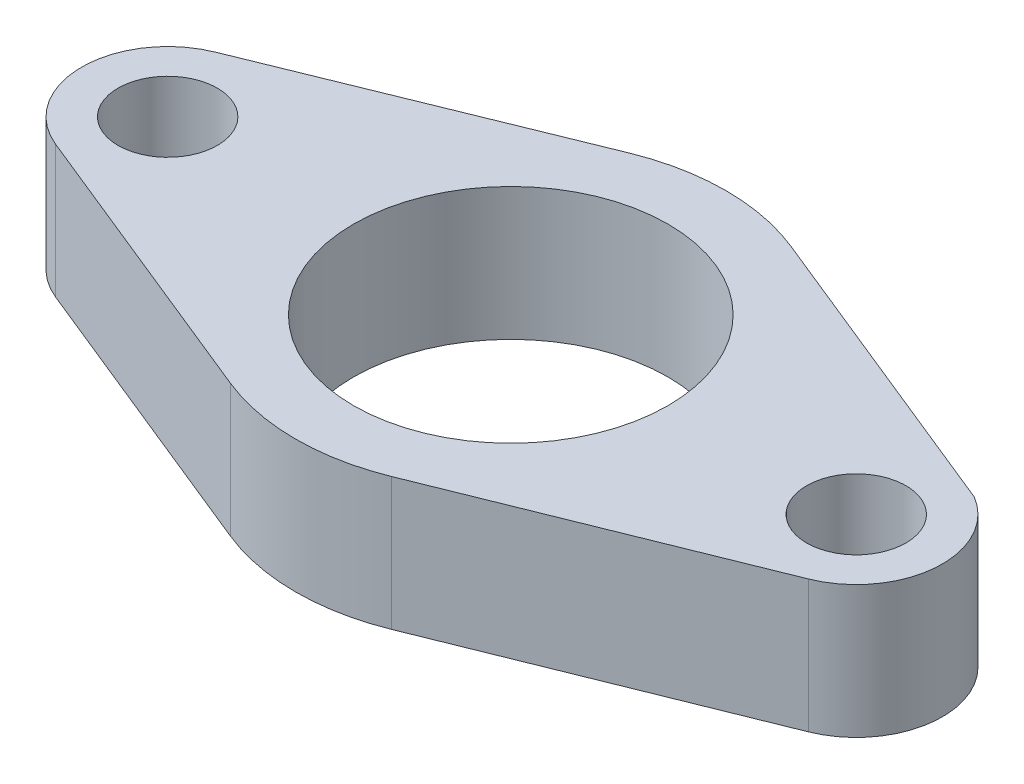
ISO-10303-21;
HEADER;
FILE_DESCRIPTION(('STEP AP214'),'2;1');
FILE_NAME('part.step','',(''),(''),'','','');
FILE_SCHEMA(('AUTOMOTIVE_DESIGN { 1 0 10303 214 1 1 1 1 }'));
ENDSEC;
DATA;
#1=APPLICATION_CONTEXT('core data for automotive mechanical design processes');
#2=APPLICATION_PROTOCOL_DEFINITION('international standard','automotive_design',2000,#1);
#3=PRODUCT_CONTEXT('',#1,'mechanical');
#4=PRODUCT('Part','Part','',(#3));
#5=PRODUCT_RELATED_PRODUCT_CATEGORY('part','',(#4));
#6=PRODUCT_DEFINITION_FORMATION('','',#4);
#7=PRODUCT_DEFINITION_CONTEXT('part definition',#1,'design');
#8=PRODUCT_DEFINITION('design','',#6,#7);
#9=PRODUCT_DEFINITION_SHAPE('','',#8);
#10=(LENGTH_UNIT() NAMED_UNIT(*) SI_UNIT(.MILLI.,.METRE.));
#11=(NAMED_UNIT(*) PLANE_ANGLE_UNIT() SI_UNIT($,.RADIAN.));
#12=(NAMED_UNIT(*) SI_UNIT($,.STERADIAN.) SOLID_ANGLE_UNIT());
#13=UNCERTAINTY_MEASURE_WITH_UNIT(LENGTH_MEASURE(1.E-05),#10,'distance_accuracy_value','');
#14=(GEOMETRIC_REPRESENTATION_CONTEXT(3) GLOBAL_UNCERTAINTY_ASSIGNED_CONTEXT((#13)) GLOBAL_UNIT_ASSIGNED_CONTEXT((#10,
#11,#12)) REPRESENTATION_CONTEXT('',''));
#15=CARTESIAN_POINT('',(0.,0.,0.));
#16=DIRECTION('',(0.,0.,1.));
#17=DIRECTION('',(1.,0.,0.));
#18=AXIS2_PLACEMENT_3D('',#15,#16,#17);
#19=CARTESIAN_POINT('',(-15.5330436319547,12.7,38.2406875007209));
#20=DIRECTION('',(-0.376330554378068,0.,0.926485463373007));
#21=DIRECTION('',(0.926485463373008,0.,0.376330554378068));
#22=AXIS2_PLACEMENT_3D('',#19,#20,#21);
#23=PLANE('',#22);
#24=DIRECTION('',(-0.926485463373008,0.,-0.376330554378068));
#25=VECTOR('',#24,1.);
#26=CARTESIAN_POINT('',(-15.5330436319547,-12.7,38.2406875007209));
#27=LINE('',#26,#25);
#28=CARTESIAN_POINT('',(-15.5330436319547,-12.7,38.2406875007209));
#29=VERTEX_POINT('',#28);
#30=CARTESIAN_POINT('',(-72.0197264164965,-12.7,15.2962750002883));
#31=VERTEX_POINT('',#30);
#32=EDGE_CURVE('E138',#29,#31,#27,.T.);
#33=ORIENTED_EDGE('',*,*,#32,.F.);
#34=DIRECTION('',(0.,-1.,0.));
#35=VECTOR('',#34,1.);
#36=CARTESIAN_POINT('',(-15.5330436319547,12.7,38.2406875007209));
#37=LINE('',#36,#35);
#38=CARTESIAN_POINT('',(-15.5330436319547,12.7,38.2406875007209));
#39=VERTEX_POINT('',#38);
#40=EDGE_CURVE('E11',#39,#29,#37,.T.);
#41=ORIENTED_EDGE('',*,*,#40,.F.);
#42=DIRECTION('',(-0.926485463373008,0.,-0.376330554378068));
#43=VECTOR('',#42,1.);
#44=CARTESIAN_POINT('',(-15.5330436319547,12.7,38.2406875007209));
#45=LINE('',#44,#43);
#46=CARTESIAN_POINT('',(-72.0197264164965,12.7,15.2962750002883));
#47=VERTEX_POINT('',#46);
#48=EDGE_CURVE('E187',#39,#47,#45,.T.);
#49=ORIENTED_EDGE('',*,*,#48,.T.);
#50=DIRECTION('',(0.,-1.,0.));
#51=VECTOR('',#50,1.);
#52=CARTESIAN_POINT('',(-72.0197264164965,12.7,15.2962750002883));
#53=LINE('',#52,#51);
#54=EDGE_CURVE('E86',#47,#31,#53,.T.);
#55=ORIENTED_EDGE('',*,*,#54,.T.);
#56=EDGE_LOOP('',(#33,#41,#49,#55));
#57=FACE_BOUND('',#56,.T.);
#58=ADVANCED_FACE('F35',(#57),#23,.T.);
#59=CARTESIAN_POINT('',(0.,12.7,0.));
#60=DIRECTION('',(0.,-1.,0.));
#61=DIRECTION('',(0.,0.,-1.));
#62=AXIS2_PLACEMENT_3D('',#59,#60,#61);
#63=CYLINDRICAL_SURFACE('',#62,41.275);
#64=CARTESIAN_POINT('',(0.,-12.7,0.));
#65=DIRECTION('',(0.,1.,0.));
#66=DIRECTION('',(0.,0.,1.));
#67=AXIS2_PLACEMENT_3D('',#64,#65,#66);
#68=CIRCLE('',#67,41.275);
#69=CARTESIAN_POINT('',(15.423593340516,-12.7,38.2849630203085));
#70=VERTEX_POINT('',#69);
#71=EDGE_CURVE('E141',#29,#70,#68,.T.);
#72=ORIENTED_EDGE('',*,*,#71,.T.);
#73=DIRECTION('',(0.,-1.,0.));
#74=VECTOR('',#73,1.);
#75=CARTESIAN_POINT('',(15.423593340516,12.7,38.2849630203085));
#76=LINE('',#75,#74);
#77=CARTESIAN_POINT('',(15.423593340516,12.7,38.2849630203085));
#78=VERTEX_POINT('',#77);
#79=EDGE_CURVE('E44',#78,#70,#76,.T.);
#80=ORIENTED_EDGE('',*,*,#79,.F.);
#81=CARTESIAN_POINT('',(0.,12.7,0.));
#82=DIRECTION('',(0.,1.,0.));
#83=DIRECTION('',(0.,0.,1.));
#84=AXIS2_PLACEMENT_3D('',#81,#82,#83);
#85=CIRCLE('',#84,41.275);
#86=EDGE_CURVE('E185',#39,#78,#85,.T.);
#87=ORIENTED_EDGE('',*,*,#86,.F.);
#88=ORIENTED_EDGE('',*,*,#40,.T.);
#89=EDGE_LOOP('',(#72,#80,#87,#88));
#90=FACE_BOUND('',#89,.T.);
#91=ADVANCED_FACE('F174',(#90),#63,.T.);
#92=CARTESIAN_POINT('',(15.423593340516,12.7,38.2849630203085));
#93=DIRECTION('',(0.373678821090637,0.,0.927558159183731));
#94=DIRECTION('',(0.927558159183731,0.,-0.373678821090637));
#95=AXIS2_PLACEMENT_3D('',#92,#93,#94);
#96=PLANE('',#95);
#97=DIRECTION('',(-0.927558159183731,0.,0.373678821090637));
#98=VECTOR('',#97,1.);
#99=CARTESIAN_POINT('',(15.423593340516,-12.7,38.2849630203085));
#100=LINE('',#99,#98);
#101=CARTESIAN_POINT('',(72.4429283724918,-12.7,15.3139852081234));
#102=VERTEX_POINT('',#101);
#103=EDGE_CURVE('E144',#102,#70,#100,.T.);
#104=ORIENTED_EDGE('',*,*,#103,.F.);
#105=DIRECTION('',(0.,-1.,0.));
#106=VECTOR('',#105,1.);
#107=CARTESIAN_POINT('',(72.4429283724918,12.7,15.3139852081234));
#108=LINE('',#107,#106);
#109=CARTESIAN_POINT('',(72.4429283724918,12.7,15.3139852081234));
#110=VERTEX_POINT('',#109);
#111=EDGE_CURVE('E164',#110,#102,#108,.T.);
#112=ORIENTED_EDGE('',*,*,#111,.F.);
#113=DIRECTION('',(-0.927558159183731,0.,0.373678821090637));
#114=VECTOR('',#113,1.);
#115=CARTESIAN_POINT('',(15.423593340516,12.7,38.2849630203085));
#116=LINE('',#115,#114);
#117=EDGE_CURVE('E171',#110,#78,#116,.T.);
#118=ORIENTED_EDGE('',*,*,#117,.T.);
#119=ORIENTED_EDGE('',*,*,#79,.T.);
#120=EDGE_LOOP('',(#104,#112,#118,#119));
#121=FACE_BOUND('',#120,.T.);
#122=ADVANCED_FACE('F169',(#121),#96,.T.);
#123=CARTESIAN_POINT('',(66.2734910362854,12.7,0.));
#124=DIRECTION('',(0.,-1.,0.));
#125=DIRECTION('',(0.,0.,-1.));
#126=AXIS2_PLACEMENT_3D('',#123,#124,#125);
#127=CYLINDRICAL_SURFACE('',#126,16.51);
#128=CARTESIAN_POINT('',(66.2734910362854,-12.7,0.));
#129=DIRECTION('',(0.,1.,0.));
#130=DIRECTION('',(0.,0.,1.));
#131=AXIS2_PLACEMENT_3D('',#128,#129,#130);
#132=CIRCLE('',#131,16.51);
#133=CARTESIAN_POINT('',(74.6464597303202,-12.7,-14.2293181582503));
#134=VERTEX_POINT('',#133);
#135=EDGE_CURVE('E147',#102,#134,#132,.T.);
#136=ORIENTED_EDGE('',*,*,#135,.T.);
#137=DIRECTION('',(0.,-1.,0.));
#138=VECTOR('',#137,1.);
#139=CARTESIAN_POINT('',(74.6464597303202,12.7,-14.2293181582503));
#140=LINE('',#139,#138);
#141=CARTESIAN_POINT('',(74.6464597303202,12.7,-14.2293181582503));
#142=VERTEX_POINT('',#141);
#143=EDGE_CURVE('E162',#142,#134,#140,.T.);
#144=ORIENTED_EDGE('',*,*,#143,.F.);
#145=CARTESIAN_POINT('',(66.2734910362854,12.7,0.));
#146=DIRECTION('',(0.,1.,0.));
#147=DIRECTION('',(0.,0.,1.));
#148=AXIS2_PLACEMENT_3D('',#145,#146,#147);
#149=CIRCLE('',#148,16.51);
#150=EDGE_CURVE('E183',#110,#142,#149,.T.);
#151=ORIENTED_EDGE('',*,*,#150,.F.);
#152=ORIENTED_EDGE('',*,*,#111,.T.);
#153=EDGE_LOOP('',(#136,#144,#151,#152));
#154=FACE_BOUND('',#153,.T.);
#155=ADVANCED_FACE('F181',(#154),#127,.T.);
#156=CARTESIAN_POINT('',(15.5330436319547,12.7,-38.2406875007209));
#157=DIRECTION('',(0.376330554378068,0.,-0.926485463373007));
#158=DIRECTION('',(-0.926485463373007,0.,-0.376330554378068));
#159=AXIS2_PLACEMENT_3D('',#156,#157,#158);
#160=PLANE('',#159);
#161=DIRECTION('',(0.926485463373008,0.,0.376330554378068));
#162=VECTOR('',#161,1.);
#163=CARTESIAN_POINT('',(15.5330436319547,-12.7,-38.2406875007209));
#164=LINE('',#163,#162);
#165=CARTESIAN_POINT('',(15.5330436319547,-12.7,-38.2406875007209));
#166=VERTEX_POINT('',#165);
#167=EDGE_CURVE('E150',#166,#134,#164,.T.);
#168=ORIENTED_EDGE('',*,*,#167,.F.);
#169=DIRECTION('',(0.,-1.,0.));
#170=VECTOR('',#169,1.);
#171=CARTESIAN_POINT('',(15.5330436319547,12.7,-38.2406875007209));
#172=LINE('',#171,#170);
#173=CARTESIAN_POINT('',(15.5330436319547,12.7,-38.2406875007209));
#174=VERTEX_POINT('',#173);
#175=EDGE_CURVE('E122',#174,#166,#172,.T.);
#176=ORIENTED_EDGE('',*,*,#175,.F.);
#177=DIRECTION('',(0.926485463373008,0.,0.376330554378068));
#178=VECTOR('',#177,1.);
#179=CARTESIAN_POINT('',(15.5330436319547,12.7,-38.2406875007209));
#180=LINE('',#179,#178);
#181=EDGE_CURVE('E111',#174,#142,#180,.T.);
#182=ORIENTED_EDGE('',*,*,#181,.T.);
#183=ORIENTED_EDGE('',*,*,#143,.T.);
#184=EDGE_LOOP('',(#168,#176,#182,#183));
#185=FACE_BOUND('',#184,.T.);
#186=ADVANCED_FACE('F191',(#185),#160,.T.);
#187=CARTESIAN_POINT('',(0.,12.7,0.));
#188=DIRECTION('',(0.,-1.,0.));
#189=DIRECTION('',(0.,0.,-1.));
#190=AXIS2_PLACEMENT_3D('',#187,#188,#189);
#191=CYLINDRICAL_SURFACE('',#190,41.275);
#192=CARTESIAN_POINT('',(0.,-12.7,0.));
#193=DIRECTION('',(0.,1.,0.));
#194=DIRECTION('',(0.,0.,1.));
#195=AXIS2_PLACEMENT_3D('',#192,#193,#194);
#196=CIRCLE('',#195,41.275);
#197=CARTESIAN_POINT('',(-15.5330436319547,-12.7,-38.2406875007209));
#198=VERTEX_POINT('',#197);
#199=EDGE_CURVE('E118',#166,#198,#196,.T.);
#200=ORIENTED_EDGE('',*,*,#199,.T.);
#201=DIRECTION('',(0.,-1.,0.));
#202=VECTOR('',#201,1.);
#203=CARTESIAN_POINT('',(-15.5330436319547,12.7,-38.2406875007209));
#204=LINE('',#203,#202);
#205=CARTESIAN_POINT('',(-15.5330436319547,12.7,-38.2406875007209));
#206=VERTEX_POINT('',#205);
#207=EDGE_CURVE('E115',#206,#198,#204,.T.);
#208=ORIENTED_EDGE('',*,*,#207,.F.);
#209=CARTESIAN_POINT('',(0.,12.7,0.));
#210=DIRECTION('',(0.,1.,0.));
#211=DIRECTION('',(0.,0.,1.));
#212=AXIS2_PLACEMENT_3D('',#209,#210,#211);
#213=CIRCLE('',#212,41.275);
#214=EDGE_CURVE('E105',#174,#206,#213,.T.);
#215=ORIENTED_EDGE('',*,*,#214,.F.);
#216=ORIENTED_EDGE('',*,*,#175,.T.);
#217=EDGE_LOOP('',(#200,#208,#215,#216));
#218=FACE_BOUND('',#217,.T.);
#219=ADVANCED_FACE('F116',(#218),#191,.T.);
#220=CARTESIAN_POINT('',(-15.5330436319547,12.7,-38.2406875007209));
#221=DIRECTION('',(-0.376330554378067,0.,-0.926485463373007));
#222=DIRECTION('',(-0.926485463373008,0.,0.376330554378068));
#223=AXIS2_PLACEMENT_3D('',#220,#221,#222);
#224=PLANE('',#223);
#225=DIRECTION('',(0.926485463373008,0.,-0.376330554378067));
#226=VECTOR('',#225,1.);
#227=CARTESIAN_POINT('',(-15.5330436319547,-12.7,-38.2406875007209));
#228=LINE('',#227,#226);
#229=CARTESIAN_POINT('',(-72.0197264164965,-12.7,-15.2962750002883));
#230=VERTEX_POINT('',#229);
#231=EDGE_CURVE('E154',#230,#198,#228,.T.);
#232=ORIENTED_EDGE('',*,*,#231,.F.);
#233=DIRECTION('',(0.,-1.,0.));
#234=VECTOR('',#233,1.);
#235=CARTESIAN_POINT('',(-72.0197264164965,12.7,-15.2962750002883));
#236=LINE('',#235,#234);
#237=CARTESIAN_POINT('',(-72.0197264164965,12.7,-15.2962750002883));
#238=VERTEX_POINT('',#237);
#239=EDGE_CURVE('E79',#238,#230,#236,.T.);
#240=ORIENTED_EDGE('',*,*,#239,.F.);
#241=DIRECTION('',(0.926485463373008,0.,-0.376330554378067));
#242=VECTOR('',#241,1.);
#243=CARTESIAN_POINT('',(-15.5330436319547,12.7,-38.2406875007209));
#244=LINE('',#243,#242);
#245=EDGE_CURVE('E109',#238,#206,#244,.T.);
#246=ORIENTED_EDGE('',*,*,#245,.T.);
#247=ORIENTED_EDGE('',*,*,#207,.T.);
#248=EDGE_LOOP('',(#232,#240,#246,#247));
#249=FACE_BOUND('',#248,.T.);
#250=ADVANCED_FACE('F124',(#249),#224,.T.);
#251=CARTESIAN_POINT('',(-65.8065089637146,12.7,0.));
#252=DIRECTION('',(0.,-1.,0.));
#253=DIRECTION('',(0.,0.,-1.));
#254=AXIS2_PLACEMENT_3D('',#251,#252,#253);
#255=CYLINDRICAL_SURFACE('',#254,9.525);
#256=CARTESIAN_POINT('',(-65.8065089637146,12.7,0.));
#257=DIRECTION('',(0.,1.,0.));
#258=DIRECTION('',(0.,0.,1.));
#259=AXIS2_PLACEMENT_3D('',#256,#257,#258);
#260=CIRCLE('',#259,9.525);
#261=CARTESIAN_POINT('',(-65.8065089637146,12.7,9.525));
#262=VERTEX_POINT('',#261);
#263=EDGE_CURVE('E193',#262,#262,#260,.T.);
#264=ORIENTED_EDGE('',*,*,#263,.T.);
#265=EDGE_LOOP('',(#264));
#266=FACE_BOUND('',#265,.T.);
#267=CARTESIAN_POINT('',(-65.8065089637146,-12.7,0.));
#268=DIRECTION('',(0.,1.,0.));
#269=DIRECTION('',(0.,0.,1.));
#270=AXIS2_PLACEMENT_3D('',#267,#268,#269);
#271=CIRCLE('',#270,9.525);
#272=CARTESIAN_POINT('',(-65.8065089637146,-12.7,9.525));
#273=VERTEX_POINT('',#272);
#274=EDGE_CURVE('E135',#273,#273,#271,.T.);
#275=ORIENTED_EDGE('',*,*,#274,.F.);
#276=EDGE_LOOP('',(#275));
#277=FACE_BOUND('',#276,.T.);
#278=ADVANCED_FACE('F212',(#266,#277),#255,.F.);
#279=CARTESIAN_POINT('',(0.,12.7,0.));
#280=DIRECTION('',(0.,-1.,0.));
#281=DIRECTION('',(0.,0.,-1.));
#282=AXIS2_PLACEMENT_3D('',#279,#280,#281);
#283=CYLINDRICAL_SURFACE('',#282,30.1625);
#284=CARTESIAN_POINT('',(0.,12.7,0.));
#285=DIRECTION('',(0.,1.,0.));
#286=DIRECTION('',(0.,0.,1.));
#287=AXIS2_PLACEMENT_3D('',#284,#285,#286);
#288=CIRCLE('',#287,30.1625);
#289=CARTESIAN_POINT('',(0.,12.7,30.1625));
#290=VERTEX_POINT('',#289);
#291=EDGE_CURVE('E195',#290,#290,#288,.T.);
#292=ORIENTED_EDGE('',*,*,#291,.T.);
#293=EDGE_LOOP('',(#292));
#294=FACE_BOUND('',#293,.T.);
#295=CARTESIAN_POINT('',(0.,-12.7,0.));
#296=DIRECTION('',(0.,1.,0.));
#297=DIRECTION('',(0.,0.,1.));
#298=AXIS2_PLACEMENT_3D('',#295,#296,#297);
#299=CIRCLE('',#298,30.1625);
#300=CARTESIAN_POINT('',(0.,-12.7,30.1625));
#301=VERTEX_POINT('',#300);
#302=EDGE_CURVE('E132',#301,#301,#299,.T.);
#303=ORIENTED_EDGE('',*,*,#302,.F.);
#304=EDGE_LOOP('',(#303));
#305=FACE_BOUND('',#304,.T.);
#306=ADVANCED_FACE('F215',(#294,#305),#283,.F.);
#307=CARTESIAN_POINT('',(66.2734910362854,12.7,0.));
#308=DIRECTION('',(0.,-1.,0.));
#309=DIRECTION('',(0.,0.,-1.));
#310=AXIS2_PLACEMENT_3D('',#307,#308,#309);
#311=CYLINDRICAL_SURFACE('',#310,9.52500000000001);
#312=CARTESIAN_POINT('',(66.2734910362854,12.7,0.));
#313=DIRECTION('',(0.,1.,0.));
#314=DIRECTION('',(0.,0.,1.));
#315=AXIS2_PLACEMENT_3D('',#312,#313,#314);
#316=CIRCLE('',#315,9.52500000000001);
#317=CARTESIAN_POINT('',(66.2734910362854,12.7,9.52500000000001));
#318=VERTEX_POINT('',#317);
#319=EDGE_CURVE('E158',#318,#318,#316,.T.);
#320=ORIENTED_EDGE('',*,*,#319,.T.);
#321=EDGE_LOOP('',(#320));
#322=FACE_BOUND('',#321,.T.);
#323=CARTESIAN_POINT('',(66.2734910362854,-12.7,0.));
#324=DIRECTION('',(0.,1.,0.));
#325=DIRECTION('',(0.,0.,1.));
#326=AXIS2_PLACEMENT_3D('',#323,#324,#325);
#327=CIRCLE('',#326,9.52500000000001);
#328=CARTESIAN_POINT('',(66.2734910362854,-12.7,9.52500000000001));
#329=VERTEX_POINT('',#328);
#330=EDGE_CURVE('E129',#329,#329,#327,.T.);
#331=ORIENTED_EDGE('',*,*,#330,.F.);
#332=EDGE_LOOP('',(#331));
#333=FACE_BOUND('',#332,.T.);
#334=ADVANCED_FACE('F37',(#322,#333),#311,.F.);
#335=CARTESIAN_POINT('',(-65.8065089637146,12.7,0.));
#336=DIRECTION('',(0.,-1.,0.));
#337=DIRECTION('',(0.,0.,-1.));
#338=AXIS2_PLACEMENT_3D('',#335,#336,#337);
#339=CYLINDRICAL_SURFACE('',#338,16.51);
#340=CARTESIAN_POINT('',(-65.8065089637146,-12.7,0.));
#341=DIRECTION('',(0.,1.,0.));
#342=DIRECTION('',(0.,0.,1.));
#343=AXIS2_PLACEMENT_3D('',#340,#341,#342);
#344=CIRCLE('',#343,16.51);
#345=EDGE_CURVE('E156',#230,#31,#344,.T.);
#346=ORIENTED_EDGE('',*,*,#345,.T.);
#347=ORIENTED_EDGE('',*,*,#54,.F.);
#348=CARTESIAN_POINT('',(-65.8065089637146,12.7,0.));
#349=DIRECTION('',(0.,1.,0.));
#350=DIRECTION('',(0.,0.,1.));
#351=AXIS2_PLACEMENT_3D('',#348,#349,#350);
#352=CIRCLE('',#351,16.51);
#353=EDGE_CURVE('E52',#238,#47,#352,.T.);
#354=ORIENTED_EDGE('',*,*,#353,.F.);
#355=ORIENTED_EDGE('',*,*,#239,.T.);
#356=EDGE_LOOP('',(#346,#347,#354,#355));
#357=FACE_BOUND('',#356,.T.);
#358=ADVANCED_FACE('F192',(#357),#339,.T.);
#359=CARTESIAN_POINT('',(0.,12.7,0.));
#360=DIRECTION('',(0.,1.,0.));
#361=DIRECTION('',(0.,0.,1.));
#362=AXIS2_PLACEMENT_3D('',#359,#360,#361);
#363=PLANE('',#362);
#364=ORIENTED_EDGE('',*,*,#319,.F.);
#365=EDGE_LOOP('',(#364));
#366=FACE_BOUND('',#365,.T.);
#367=ORIENTED_EDGE('',*,*,#291,.F.);
#368=EDGE_LOOP('',(#367));
#369=FACE_BOUND('',#368,.T.);
#370=ORIENTED_EDGE('',*,*,#263,.F.);
#371=EDGE_LOOP('',(#370));
#372=FACE_BOUND('',#371,.T.);
#373=ORIENTED_EDGE('',*,*,#48,.F.);
#374=ORIENTED_EDGE('',*,*,#86,.T.);
#375=ORIENTED_EDGE('',*,*,#117,.F.);
#376=ORIENTED_EDGE('',*,*,#150,.T.);
#377=ORIENTED_EDGE('',*,*,#181,.F.);
#378=ORIENTED_EDGE('',*,*,#214,.T.);
#379=ORIENTED_EDGE('',*,*,#245,.F.);
#380=ORIENTED_EDGE('',*,*,#353,.T.);
#381=EDGE_LOOP('',(#373,#374,#375,#376,#377,#378,#379,#380));
#382=FACE_BOUND('',#381,.T.);
#383=ADVANCED_FACE('F107',(#366,#369,#372,#382),#363,.T.);
#384=CARTESIAN_POINT('',(0.,-12.7,0.));
#385=DIRECTION('',(0.,1.,0.));
#386=DIRECTION('',(0.,0.,1.));
#387=AXIS2_PLACEMENT_3D('',#384,#385,#386);
#388=PLANE('',#387);
#389=ORIENTED_EDGE('',*,*,#330,.T.);
#390=EDGE_LOOP('',(#389));
#391=FACE_BOUND('',#390,.T.);
#392=ORIENTED_EDGE('',*,*,#302,.T.);
#393=EDGE_LOOP('',(#392));
#394=FACE_BOUND('',#393,.T.);
#395=ORIENTED_EDGE('',*,*,#274,.T.);
#396=EDGE_LOOP('',(#395));
#397=FACE_BOUND('',#396,.T.);
#398=ORIENTED_EDGE('',*,*,#32,.T.);
#399=ORIENTED_EDGE('',*,*,#345,.F.);
#400=ORIENTED_EDGE('',*,*,#231,.T.);
#401=ORIENTED_EDGE('',*,*,#199,.F.);
#402=ORIENTED_EDGE('',*,*,#167,.T.);
#403=ORIENTED_EDGE('',*,*,#135,.F.);
#404=ORIENTED_EDGE('',*,*,#103,.T.);
#405=ORIENTED_EDGE('',*,*,#71,.F.);
#406=EDGE_LOOP('',(#398,#399,#400,#401,#402,#403,#404,#405));
#407=FACE_BOUND('',#406,.T.);
#408=ADVANCED_FACE('F177',(#391,#394,#397,#407),#388,.F.);
#409=CLOSED_SHELL('',(#58,#91,#122,#155,#186,#219,#250,#278,#306,#334,#358,#383,#408));
#410=MANIFOLD_SOLID_BREP('B2',#409);
#411=ADVANCED_BREP_SHAPE_REPRESENTATION('',(#18,#410),#14);
#412=SHAPE_DEFINITION_REPRESENTATION(#9,#411);
ENDSEC;
END-ISO-10303-21;
